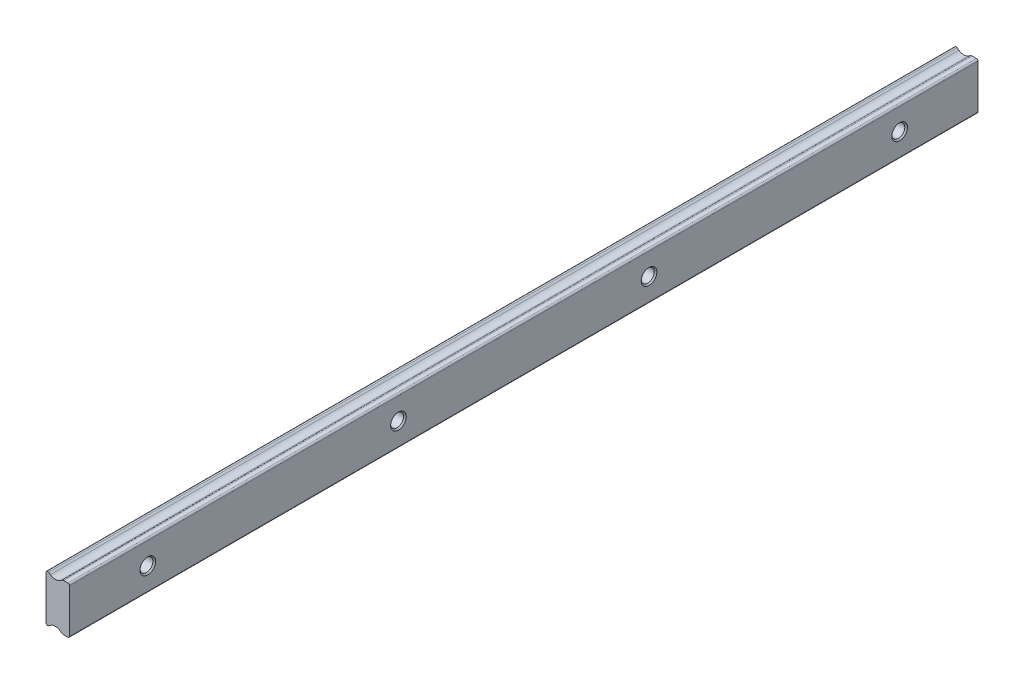
ISO-10303-21;
HEADER;
FILE_DESCRIPTION(('STEP AP214'),'2;1');
FILE_NAME('part.step','',(''),(''),'','','');
FILE_SCHEMA(('AUTOMOTIVE_DESIGN { 1 0 10303 214 1 1 1 1 }'));
ENDSEC;
DATA;
#1=APPLICATION_CONTEXT('core data for automotive mechanical design processes');
#2=APPLICATION_PROTOCOL_DEFINITION('international standard','automotive_design',2000,#1);
#3=PRODUCT_CONTEXT('',#1,'mechanical');
#4=PRODUCT('Part','Part','',(#3));
#5=PRODUCT_RELATED_PRODUCT_CATEGORY('part','',(#4));
#6=PRODUCT_DEFINITION_FORMATION('','',#4);
#7=PRODUCT_DEFINITION_CONTEXT('part definition',#1,'design');
#8=PRODUCT_DEFINITION('design','',#6,#7);
#9=PRODUCT_DEFINITION_SHAPE('','',#8);
#10=(LENGTH_UNIT() NAMED_UNIT(*) SI_UNIT(.MILLI.,.METRE.));
#11=(NAMED_UNIT(*) PLANE_ANGLE_UNIT() SI_UNIT($,.RADIAN.));
#12=(NAMED_UNIT(*) SI_UNIT($,.STERADIAN.) SOLID_ANGLE_UNIT());
#13=UNCERTAINTY_MEASURE_WITH_UNIT(LENGTH_MEASURE(1.E-05),#10,'distance_accuracy_value','');
#14=(GEOMETRIC_REPRESENTATION_CONTEXT(3) GLOBAL_UNCERTAINTY_ASSIGNED_CONTEXT((#13)) GLOBAL_UNIT_ASSIGNED_CONTEXT((#10,
#11,#12)) REPRESENTATION_CONTEXT('',''));
#15=CARTESIAN_POINT('',(0.,0.,0.));
#16=DIRECTION('',(0.,0.,1.));
#17=DIRECTION('',(1.,0.,0.));
#18=AXIS2_PLACEMENT_3D('',#15,#16,#17);
#19=CARTESIAN_POINT('',(8.5,23.2723118075792,148.));
#20=DIRECTION('',(0.,0.,-1.));
#21=DIRECTION('',(-1.,0.,0.));
#22=AXIS2_PLACEMENT_3D('',#19,#20,#21);
#23=CYLINDRICAL_SURFACE('',#22,2.7779999999999);
#24=CARTESIAN_POINT('',(8.5,23.2723118075792,-142.));
#25=DIRECTION('',(0.,0.,1.));
#26=DIRECTION('',(1.,0.,0.));
#27=AXIS2_PLACEMENT_3D('',#24,#25,#26);
#28=CIRCLE('',#27,2.7779999999999);
#29=CARTESIAN_POINT('',(6.9066046598168,20.9967074285445,-142.));
#30=VERTEX_POINT('',#29);
#31=CARTESIAN_POINT('',(10.0933953401832,20.9967074285445,-142.));
#32=VERTEX_POINT('',#31);
#33=EDGE_CURVE('E386',#30,#32,#28,.T.);
#34=ORIENTED_EDGE('',*,*,#33,.F.);
#35=DIRECTION('',(0.,0.,-1.));
#36=VECTOR('',#35,1.);
#37=CARTESIAN_POINT('',(6.9066046598168,20.9967074285445,148.));
#38=LINE('',#37,#36);
#39=CARTESIAN_POINT('',(6.9066046598168,20.9967074285445,148.));
#40=VERTEX_POINT('',#39);
#41=EDGE_CURVE('E402',#40,#30,#38,.T.);
#42=ORIENTED_EDGE('',*,*,#41,.F.);
#43=CARTESIAN_POINT('',(8.5,23.2723118075792,148.));
#44=DIRECTION('',(0.,0.,1.));
#45=DIRECTION('',(1.,0.,0.));
#46=AXIS2_PLACEMENT_3D('',#43,#44,#45);
#47=CIRCLE('',#46,2.7779999999999);
#48=CARTESIAN_POINT('',(10.0933953401832,20.9967074285445,148.));
#49=VERTEX_POINT('',#48);
#50=EDGE_CURVE('E339',#40,#49,#47,.T.);
#51=ORIENTED_EDGE('',*,*,#50,.T.);
#52=DIRECTION('',(0.,0.,-1.));
#53=VECTOR('',#52,1.);
#54=CARTESIAN_POINT('',(10.0933953401832,20.9967074285445,148.));
#55=LINE('',#54,#53);
#56=EDGE_CURVE('E400',#49,#32,#55,.T.);
#57=ORIENTED_EDGE('',*,*,#56,.T.);
#58=EDGE_LOOP('',(#34,#42,#51,#57));
#59=FACE_BOUND('',#58,.T.);
#60=ADVANCED_FACE('F34',(#59),#23,.F.);
#61=CARTESIAN_POINT('',(3.75,10.45,-130.75));
#62=DIRECTION('',(-1.,0.,0.));
#63=DIRECTION('',(0.,0.,1.));
#64=AXIS2_PLACEMENT_3D('',#61,#62,#63);
#65=PLANE('',#64);
#66=DIRECTION('',(0.,1.,0.));
#67=VECTOR('',#66,1.);
#68=CARTESIAN_POINT('',(3.75,10.45,-134.75));
#69=LINE('',#68,#67);
#70=CARTESIAN_POINT('',(3.75,10.45,-134.75));
#71=VERTEX_POINT('',#70);
#72=CARTESIAN_POINT('',(3.75,14.45,-134.75));
#73=VERTEX_POINT('',#72);
#74=EDGE_CURVE('E242',#71,#73,#69,.T.);
#75=ORIENTED_EDGE('',*,*,#74,.F.);
#76=DIRECTION('',(0.,0.,-1.));
#77=VECTOR('',#76,1.);
#78=CARTESIAN_POINT('',(3.75,10.45,-130.75));
#79=LINE('',#78,#77);
#80=CARTESIAN_POINT('',(3.75,10.45,-130.75));
#81=VERTEX_POINT('',#80);
#82=EDGE_CURVE('E251',#81,#71,#79,.T.);
#83=ORIENTED_EDGE('',*,*,#82,.F.);
#84=DIRECTION('',(0.,1.,0.));
#85=VECTOR('',#84,1.);
#86=CARTESIAN_POINT('',(3.75,10.45,-130.75));
#87=LINE('',#86,#85);
#88=CARTESIAN_POINT('',(3.75,14.45,-130.75));
#89=VERTEX_POINT('',#88);
#90=EDGE_CURVE('E233',#81,#89,#87,.T.);
#91=ORIENTED_EDGE('',*,*,#90,.T.);
#92=DIRECTION('',(0.,0.,-1.));
#93=VECTOR('',#92,1.);
#94=CARTESIAN_POINT('',(3.75,14.45,-130.75));
#95=LINE('',#94,#93);
#96=EDGE_CURVE('E249',#89,#73,#95,.T.);
#97=ORIENTED_EDGE('',*,*,#96,.T.);
#98=EDGE_LOOP('',(#75,#83,#91,#97));
#99=FACE_BOUND('',#98,.T.);
#100=ADVANCED_FACE('F496',(#99),#65,.T.);
#101=CARTESIAN_POINT('',(3.75,13.55,136.75));
#102=DIRECTION('',(1.,0.,0.));
#103=DIRECTION('',(0.,0.,-1.));
#104=AXIS2_PLACEMENT_3D('',#101,#102,#103);
#105=PLANE('',#104);
#106=DIRECTION('',(0.,1.,0.));
#107=VECTOR('',#106,1.);
#108=CARTESIAN_POINT('',(3.75,13.55,140.75));
#109=LINE('',#108,#107);
#110=CARTESIAN_POINT('',(3.75,13.55,140.75));
#111=VERTEX_POINT('',#110);
#112=CARTESIAN_POINT('',(3.75,17.55,140.75));
#113=VERTEX_POINT('',#112);
#114=EDGE_CURVE('E856',#111,#113,#109,.T.);
#115=ORIENTED_EDGE('',*,*,#114,.T.);
#116=DIRECTION('',(0.,0.,1.));
#117=VECTOR('',#116,1.);
#118=CARTESIAN_POINT('',(3.75,17.55,136.75));
#119=LINE('',#118,#117);
#120=CARTESIAN_POINT('',(3.75,17.55,136.75));
#121=VERTEX_POINT('',#120);
#122=EDGE_CURVE('E223',#121,#113,#119,.T.);
#123=ORIENTED_EDGE('',*,*,#122,.F.);
#124=DIRECTION('',(0.,1.,0.));
#125=VECTOR('',#124,1.);
#126=CARTESIAN_POINT('',(3.75,13.55,136.75));
#127=LINE('',#126,#125);
#128=CARTESIAN_POINT('',(3.75,13.55,136.75));
#129=VERTEX_POINT('',#128);
#130=EDGE_CURVE('E201',#129,#121,#127,.T.);
#131=ORIENTED_EDGE('',*,*,#130,.F.);
#132=DIRECTION('',(0.,0.,1.));
#133=VECTOR('',#132,1.);
#134=CARTESIAN_POINT('',(3.75,13.55,136.75));
#135=LINE('',#134,#133);
#136=EDGE_CURVE('E198',#129,#111,#135,.T.);
#137=ORIENTED_EDGE('',*,*,#136,.T.);
#138=EDGE_LOOP('',(#115,#123,#131,#137));
#139=FACE_BOUND('',#138,.T.);
#140=ADVANCED_FACE('F498',(#139),#105,.F.);
#141=CARTESIAN_POINT('',(5.5,14.,123.));
#142=DIRECTION('',(1.,0.,0.));
#143=DIRECTION('',(0.,-1.,0.));
#144=AXIS2_PLACEMENT_3D('',#141,#142,#143);
#145=CYLINDRICAL_SURFACE('',#144,2.067);
#146=CARTESIAN_POINT('',(5.933,14.,123.));
#147=DIRECTION('',(1.,0.,0.));
#148=DIRECTION('',(0.,-1.,0.));
#149=AXIS2_PLACEMENT_3D('',#146,#147,#148);
#150=CIRCLE('',#149,2.067);
#151=CARTESIAN_POINT('',(5.933,11.933,123.));
#152=VERTEX_POINT('',#151);
#153=EDGE_CURVE('E292',#152,#152,#150,.T.);
#154=ORIENTED_EDGE('',*,*,#153,.F.);
#155=EDGE_LOOP('',(#154));
#156=FACE_BOUND('',#155,.T.);
#157=CARTESIAN_POINT('',(12.567,14.,123.));
#158=DIRECTION('',(1.,0.,0.));
#159=DIRECTION('',(0.,-1.,0.));
#160=AXIS2_PLACEMENT_3D('',#157,#158,#159);
#161=CIRCLE('',#160,2.067);
#162=CARTESIAN_POINT('',(12.567,11.933,123.));
#163=VERTEX_POINT('',#162);
#164=EDGE_CURVE('E295',#163,#163,#161,.T.);
#165=ORIENTED_EDGE('',*,*,#164,.T.);
#166=EDGE_LOOP('',(#165));
#167=FACE_BOUND('',#166,.T.);
#168=ADVANCED_FACE('F505',(#156,#167),#145,.F.);
#169=CARTESIAN_POINT('',(5.5,14.,43.));
#170=DIRECTION('',(1.,0.,0.));
#171=DIRECTION('',(0.,-1.,0.));
#172=AXIS2_PLACEMENT_3D('',#169,#170,#171);
#173=CYLINDRICAL_SURFACE('',#172,2.067);
#174=CARTESIAN_POINT('',(5.933,14.,43.));
#175=DIRECTION('',(1.,0.,0.));
#176=DIRECTION('',(0.,-1.,0.));
#177=AXIS2_PLACEMENT_3D('',#174,#175,#176);
#178=CIRCLE('',#177,2.067);
#179=CARTESIAN_POINT('',(5.933,11.933,43.));
#180=VERTEX_POINT('',#179);
#181=EDGE_CURVE('E280',#180,#180,#178,.T.);
#182=ORIENTED_EDGE('',*,*,#181,.F.);
#183=EDGE_LOOP('',(#182));
#184=FACE_BOUND('',#183,.T.);
#185=CARTESIAN_POINT('',(12.567,14.,43.));
#186=DIRECTION('',(1.,0.,0.));
#187=DIRECTION('',(0.,-1.,0.));
#188=AXIS2_PLACEMENT_3D('',#185,#186,#187);
#189=CIRCLE('',#188,2.067);
#190=CARTESIAN_POINT('',(12.567,11.933,43.));
#191=VERTEX_POINT('',#190);
#192=EDGE_CURVE('E283',#191,#191,#189,.T.);
#193=ORIENTED_EDGE('',*,*,#192,.T.);
#194=EDGE_LOOP('',(#193));
#195=FACE_BOUND('',#194,.T.);
#196=ADVANCED_FACE('F540',(#184,#195),#173,.F.);
#197=CARTESIAN_POINT('',(5.5,14.,-37.));
#198=DIRECTION('',(1.,0.,0.));
#199=DIRECTION('',(0.,-1.,0.));
#200=AXIS2_PLACEMENT_3D('',#197,#198,#199);
#201=CYLINDRICAL_SURFACE('',#200,2.067);
#202=CARTESIAN_POINT('',(5.933,14.,-37.));
#203=DIRECTION('',(1.,0.,0.));
#204=DIRECTION('',(0.,-1.,0.));
#205=AXIS2_PLACEMENT_3D('',#202,#203,#204);
#206=CIRCLE('',#205,2.067);
#207=CARTESIAN_POINT('',(5.933,11.933,-37.));
#208=VERTEX_POINT('',#207);
#209=EDGE_CURVE('E268',#208,#208,#206,.T.);
#210=ORIENTED_EDGE('',*,*,#209,.F.);
#211=EDGE_LOOP('',(#210));
#212=FACE_BOUND('',#211,.T.);
#213=CARTESIAN_POINT('',(12.567,14.,-37.));
#214=DIRECTION('',(1.,0.,0.));
#215=DIRECTION('',(0.,-1.,0.));
#216=AXIS2_PLACEMENT_3D('',#213,#214,#215);
#217=CIRCLE('',#216,2.067);
#218=CARTESIAN_POINT('',(12.567,11.933,-37.));
#219=VERTEX_POINT('',#218);
#220=EDGE_CURVE('E271',#219,#219,#217,.T.);
#221=ORIENTED_EDGE('',*,*,#220,.T.);
#222=EDGE_LOOP('',(#221));
#223=FACE_BOUND('',#222,.T.);
#224=ADVANCED_FACE('F528',(#212,#223),#201,.F.);
#225=CARTESIAN_POINT('',(5.5,14.,-117.));
#226=DIRECTION('',(1.,0.,0.));
#227=DIRECTION('',(0.,-1.,0.));
#228=AXIS2_PLACEMENT_3D('',#225,#226,#227);
#229=CYLINDRICAL_SURFACE('',#228,2.067);
#230=CARTESIAN_POINT('',(5.933,14.,-117.));
#231=DIRECTION('',(1.,0.,0.));
#232=DIRECTION('',(0.,-1.,0.));
#233=AXIS2_PLACEMENT_3D('',#230,#231,#232);
#234=CIRCLE('',#233,2.067);
#235=CARTESIAN_POINT('',(5.933,11.933,-117.));
#236=VERTEX_POINT('',#235);
#237=EDGE_CURVE('E256',#236,#236,#234,.T.);
#238=ORIENTED_EDGE('',*,*,#237,.F.);
#239=EDGE_LOOP('',(#238));
#240=FACE_BOUND('',#239,.T.);
#241=CARTESIAN_POINT('',(12.567,14.,-117.));
#242=DIRECTION('',(1.,0.,0.));
#243=DIRECTION('',(0.,-1.,0.));
#244=AXIS2_PLACEMENT_3D('',#241,#242,#243);
#245=CIRCLE('',#244,2.067);
#246=CARTESIAN_POINT('',(12.567,11.933,-117.));
#247=VERTEX_POINT('',#246);
#248=EDGE_CURVE('E259',#247,#247,#245,.T.);
#249=ORIENTED_EDGE('',*,*,#248,.T.);
#250=EDGE_LOOP('',(#249));
#251=FACE_BOUND('',#250,.T.);
#252=ADVANCED_FACE('F525',(#240,#251),#229,.F.);
#253=CARTESIAN_POINT('',(5.5,10.45,-134.75));
#254=DIRECTION('',(0.,0.,-1.));
#255=DIRECTION('',(-1.,0.,0.));
#256=AXIS2_PLACEMENT_3D('',#253,#254,#255);
#257=PLANE('',#256);
#258=DIRECTION('',(0.,-1.,0.));
#259=VECTOR('',#258,1.);
#260=CARTESIAN_POINT('',(5.5,14.45,-134.75));
#261=LINE('',#260,#259);
#262=CARTESIAN_POINT('',(5.5,14.45,-134.75));
#263=VERTEX_POINT('',#262);
#264=CARTESIAN_POINT('',(5.5,10.45,-134.75));
#265=VERTEX_POINT('',#264);
#266=EDGE_CURVE('E218',#263,#265,#261,.T.);
#267=ORIENTED_EDGE('',*,*,#266,.T.);
#268=DIRECTION('',(-1.,0.,0.));
#269=VECTOR('',#268,1.);
#270=CARTESIAN_POINT('',(5.5,10.45,-134.75));
#271=LINE('',#270,#269);
#272=EDGE_CURVE('E221',#265,#71,#271,.T.);
#273=ORIENTED_EDGE('',*,*,#272,.T.);
#274=ORIENTED_EDGE('',*,*,#74,.T.);
#275=DIRECTION('',(1.,0.,0.));
#276=VECTOR('',#275,1.);
#277=CARTESIAN_POINT('',(3.75,14.45,-134.75));
#278=LINE('',#277,#276);
#279=EDGE_CURVE('E230',#73,#263,#278,.T.);
#280=ORIENTED_EDGE('',*,*,#279,.T.);
#281=EDGE_LOOP('',(#267,#273,#274,#280));
#282=FACE_BOUND('',#281,.T.);
#283=ADVANCED_FACE('F518',(#282),#257,.T.);
#284=CARTESIAN_POINT('',(5.5,10.45,-130.75));
#285=DIRECTION('',(0.,-1.,0.));
#286=DIRECTION('',(0.,0.,1.));
#287=AXIS2_PLACEMENT_3D('',#284,#285,#286);
#288=PLANE('',#287);
#289=ORIENTED_EDGE('',*,*,#272,.F.);
#290=DIRECTION('',(0.,0.,-1.));
#291=VECTOR('',#290,1.);
#292=CARTESIAN_POINT('',(5.5,10.45,-130.75));
#293=LINE('',#292,#291);
#294=CARTESIAN_POINT('',(5.5,10.45,-130.75));
#295=VERTEX_POINT('',#294);
#296=EDGE_CURVE('E238',#295,#265,#293,.T.);
#297=ORIENTED_EDGE('',*,*,#296,.F.);
#298=DIRECTION('',(-1.,0.,0.));
#299=VECTOR('',#298,1.);
#300=CARTESIAN_POINT('',(5.5,10.45,-130.75));
#301=LINE('',#300,#299);
#302=EDGE_CURVE('E229',#295,#81,#301,.T.);
#303=ORIENTED_EDGE('',*,*,#302,.T.);
#304=ORIENTED_EDGE('',*,*,#82,.T.);
#305=EDGE_LOOP('',(#289,#297,#303,#304));
#306=FACE_BOUND('',#305,.T.);
#307=ADVANCED_FACE('F514',(#306),#288,.T.);
#308=CARTESIAN_POINT('',(5.5,10.45,-130.75));
#309=DIRECTION('',(0.,0.,-1.));
#310=DIRECTION('',(-1.,0.,0.));
#311=AXIS2_PLACEMENT_3D('',#308,#309,#310);
#312=PLANE('',#311);
#313=DIRECTION('',(0.,-1.,0.));
#314=VECTOR('',#313,1.);
#315=CARTESIAN_POINT('',(5.5,14.45,-130.75));
#316=LINE('',#315,#314);
#317=CARTESIAN_POINT('',(5.5,14.45,-130.75));
#318=VERTEX_POINT('',#317);
#319=EDGE_CURVE('E227',#318,#295,#316,.T.);
#320=ORIENTED_EDGE('',*,*,#319,.F.);
#321=DIRECTION('',(1.,0.,0.));
#322=VECTOR('',#321,1.);
#323=CARTESIAN_POINT('',(3.75,14.45,-130.75));
#324=LINE('',#323,#322);
#325=EDGE_CURVE('E236',#89,#318,#324,.T.);
#326=ORIENTED_EDGE('',*,*,#325,.F.);
#327=ORIENTED_EDGE('',*,*,#90,.F.);
#328=ORIENTED_EDGE('',*,*,#302,.F.);
#329=EDGE_LOOP('',(#320,#326,#327,#328));
#330=FACE_BOUND('',#329,.T.);
#331=ADVANCED_FACE('F517',(#330),#312,.F.);
#332=CARTESIAN_POINT('',(3.75,14.45,-130.75));
#333=DIRECTION('',(0.,1.,0.));
#334=DIRECTION('',(0.,0.,-1.));
#335=AXIS2_PLACEMENT_3D('',#332,#333,#334);
#336=PLANE('',#335);
#337=ORIENTED_EDGE('',*,*,#279,.F.);
#338=ORIENTED_EDGE('',*,*,#96,.F.);
#339=ORIENTED_EDGE('',*,*,#325,.T.);
#340=DIRECTION('',(0.,0.,-1.));
#341=VECTOR('',#340,1.);
#342=CARTESIAN_POINT('',(5.5,14.45,-130.75));
#343=LINE('',#342,#341);
#344=EDGE_CURVE('E59',#318,#263,#343,.T.);
#345=ORIENTED_EDGE('',*,*,#344,.T.);
#346=EDGE_LOOP('',(#337,#338,#339,#345));
#347=FACE_BOUND('',#346,.T.);
#348=ADVANCED_FACE('F512',(#347),#336,.T.);
#349=CARTESIAN_POINT('',(5.933,14.,-117.));
#350=DIRECTION('',(-1.,0.,0.));
#351=DIRECTION('',(0.,1.,0.));
#352=AXIS2_PLACEMENT_3D('',#349,#350,#351);
#353=CONICAL_SURFACE('',#352,2.067,0.78539816339745);
#354=CARTESIAN_POINT('',(5.5,14.,-117.));
#355=DIRECTION('',(1.,0.,0.));
#356=DIRECTION('',(0.,-1.,0.));
#357=AXIS2_PLACEMENT_3D('',#354,#355,#356);
#358=CIRCLE('',#357,2.5);
#359=CARTESIAN_POINT('',(5.5,11.5,-117.));
#360=VERTEX_POINT('',#359);
#361=EDGE_CURVE('E248',#360,#360,#358,.T.);
#362=ORIENTED_EDGE('',*,*,#361,.F.);
#363=EDGE_LOOP('',(#362));
#364=FACE_BOUND('',#363,.T.);
#365=ORIENTED_EDGE('',*,*,#237,.T.);
#366=EDGE_LOOP('',(#365));
#367=FACE_BOUND('',#366,.T.);
#368=ADVANCED_FACE('F520',(#364,#367),#353,.F.);
#369=CARTESIAN_POINT('',(5.933,14.,-37.));
#370=DIRECTION('',(-1.,0.,0.));
#371=DIRECTION('',(0.,1.,0.));
#372=AXIS2_PLACEMENT_3D('',#369,#370,#371);
#373=CONICAL_SURFACE('',#372,2.067,0.78539816339745);
#374=CARTESIAN_POINT('',(5.5,14.,-37.));
#375=DIRECTION('',(1.,0.,0.));
#376=DIRECTION('',(0.,-1.,0.));
#377=AXIS2_PLACEMENT_3D('',#374,#375,#376);
#378=CIRCLE('',#377,2.5);
#379=CARTESIAN_POINT('',(5.5,11.5,-37.));
#380=VERTEX_POINT('',#379);
#381=EDGE_CURVE('E265',#380,#380,#378,.T.);
#382=ORIENTED_EDGE('',*,*,#381,.F.);
#383=EDGE_LOOP('',(#382));
#384=FACE_BOUND('',#383,.T.);
#385=ORIENTED_EDGE('',*,*,#209,.T.);
#386=EDGE_LOOP('',(#385));
#387=FACE_BOUND('',#386,.T.);
#388=ADVANCED_FACE('F523',(#384,#387),#373,.F.);
#389=CARTESIAN_POINT('',(5.933,14.,43.));
#390=DIRECTION('',(-1.,0.,0.));
#391=DIRECTION('',(0.,1.,0.));
#392=AXIS2_PLACEMENT_3D('',#389,#390,#391);
#393=CONICAL_SURFACE('',#392,2.067,0.78539816339745);
#394=CARTESIAN_POINT('',(5.5,14.,43.));
#395=DIRECTION('',(1.,0.,0.));
#396=DIRECTION('',(0.,-1.,0.));
#397=AXIS2_PLACEMENT_3D('',#394,#395,#396);
#398=CIRCLE('',#397,2.5);
#399=CARTESIAN_POINT('',(5.5,11.5,43.));
#400=VERTEX_POINT('',#399);
#401=EDGE_CURVE('E277',#400,#400,#398,.T.);
#402=ORIENTED_EDGE('',*,*,#401,.F.);
#403=EDGE_LOOP('',(#402));
#404=FACE_BOUND('',#403,.T.);
#405=ORIENTED_EDGE('',*,*,#181,.T.);
#406=EDGE_LOOP('',(#405));
#407=FACE_BOUND('',#406,.T.);
#408=ADVANCED_FACE('F536',(#404,#407),#393,.F.);
#409=CARTESIAN_POINT('',(5.933,14.,123.));
#410=DIRECTION('',(-1.,0.,0.));
#411=DIRECTION('',(0.,1.,0.));
#412=AXIS2_PLACEMENT_3D('',#409,#410,#411);
#413=CONICAL_SURFACE('',#412,2.067,0.78539816339745);
#414=CARTESIAN_POINT('',(5.5,14.,123.));
#415=DIRECTION('',(1.,0.,0.));
#416=DIRECTION('',(0.,-1.,0.));
#417=AXIS2_PLACEMENT_3D('',#414,#415,#416);
#418=CIRCLE('',#417,2.5);
#419=CARTESIAN_POINT('',(5.5,11.5,123.));
#420=VERTEX_POINT('',#419);
#421=EDGE_CURVE('E289',#420,#420,#418,.T.);
#422=ORIENTED_EDGE('',*,*,#421,.F.);
#423=EDGE_LOOP('',(#422));
#424=FACE_BOUND('',#423,.T.);
#425=ORIENTED_EDGE('',*,*,#153,.T.);
#426=EDGE_LOOP('',(#425));
#427=FACE_BOUND('',#426,.T.);
#428=ADVANCED_FACE('F548',(#424,#427),#413,.F.);
#429=CARTESIAN_POINT('',(5.5,13.55,136.75));
#430=DIRECTION('',(0.,1.,0.));
#431=DIRECTION('',(0.,0.,-1.));
#432=AXIS2_PLACEMENT_3D('',#429,#430,#431);
#433=PLANE('',#432);
#434=DIRECTION('',(-1.,0.,0.));
#435=VECTOR('',#434,1.);
#436=CARTESIAN_POINT('',(5.5,13.55,140.75));
#437=LINE('',#436,#435);
#438=CARTESIAN_POINT('',(5.5,13.55,140.75));
#439=VERTEX_POINT('',#438);
#440=EDGE_CURVE('E858',#439,#111,#437,.T.);
#441=ORIENTED_EDGE('',*,*,#440,.T.);
#442=ORIENTED_EDGE('',*,*,#136,.F.);
#443=DIRECTION('',(-1.,0.,0.));
#444=VECTOR('',#443,1.);
#445=CARTESIAN_POINT('',(5.5,13.55,136.75));
#446=LINE('',#445,#444);
#447=CARTESIAN_POINT('',(5.5,13.55,136.75));
#448=VERTEX_POINT('',#447);
#449=EDGE_CURVE('E194',#448,#129,#446,.T.);
#450=ORIENTED_EDGE('',*,*,#449,.F.);
#451=DIRECTION('',(0.,0.,1.));
#452=VECTOR('',#451,1.);
#453=CARTESIAN_POINT('',(5.5,13.55,136.75));
#454=LINE('',#453,#452);
#455=EDGE_CURVE('E51',#448,#439,#454,.T.);
#456=ORIENTED_EDGE('',*,*,#455,.T.);
#457=EDGE_LOOP('',(#441,#442,#450,#456));
#458=FACE_BOUND('',#457,.T.);
#459=ADVANCED_FACE('F196',(#458),#433,.F.);
#460=CARTESIAN_POINT('',(5.5,13.55,140.75));
#461=DIRECTION('',(0.,0.,-1.));
#462=DIRECTION('',(-1.,0.,0.));
#463=AXIS2_PLACEMENT_3D('',#460,#461,#462);
#464=PLANE('',#463);
#465=DIRECTION('',(0.,-1.,0.));
#466=VECTOR('',#465,1.);
#467=CARTESIAN_POINT('',(5.5,17.55,140.75));
#468=LINE('',#467,#466);
#469=CARTESIAN_POINT('',(5.5,17.55,140.75));
#470=VERTEX_POINT('',#469);
#471=EDGE_CURVE('E217',#470,#439,#468,.T.);
#472=ORIENTED_EDGE('',*,*,#471,.F.);
#473=DIRECTION('',(1.,0.,0.));
#474=VECTOR('',#473,1.);
#475=CARTESIAN_POINT('',(3.75,17.55,140.75));
#476=LINE('',#475,#474);
#477=EDGE_CURVE('E211',#113,#470,#476,.T.);
#478=ORIENTED_EDGE('',*,*,#477,.F.);
#479=ORIENTED_EDGE('',*,*,#114,.F.);
#480=ORIENTED_EDGE('',*,*,#440,.F.);
#481=EDGE_LOOP('',(#472,#478,#479,#480));
#482=FACE_BOUND('',#481,.T.);
#483=ADVANCED_FACE('F778',(#482),#464,.F.);
#484=CARTESIAN_POINT('',(3.75,17.55,136.75));
#485=DIRECTION('',(0.,-1.,0.));
#486=DIRECTION('',(0.,0.,1.));
#487=AXIS2_PLACEMENT_3D('',#484,#485,#486);
#488=PLANE('',#487);
#489=ORIENTED_EDGE('',*,*,#477,.T.);
#490=DIRECTION('',(0.,0.,1.));
#491=VECTOR('',#490,1.);
#492=CARTESIAN_POINT('',(5.5,17.55,136.75));
#493=LINE('',#492,#491);
#494=CARTESIAN_POINT('',(5.5,17.55,136.75));
#495=VERTEX_POINT('',#494);
#496=EDGE_CURVE('E853',#495,#470,#493,.T.);
#497=ORIENTED_EDGE('',*,*,#496,.F.);
#498=DIRECTION('',(1.,0.,0.));
#499=VECTOR('',#498,1.);
#500=CARTESIAN_POINT('',(3.75,17.55,136.75));
#501=LINE('',#500,#499);
#502=EDGE_CURVE('E207',#121,#495,#501,.T.);
#503=ORIENTED_EDGE('',*,*,#502,.F.);
#504=ORIENTED_EDGE('',*,*,#122,.T.);
#505=EDGE_LOOP('',(#489,#497,#503,#504));
#506=FACE_BOUND('',#505,.T.);
#507=ADVANCED_FACE('F773',(#506),#488,.F.);
#508=CARTESIAN_POINT('',(5.5,13.55,136.75));
#509=DIRECTION('',(0.,0.,-1.));
#510=DIRECTION('',(-1.,0.,0.));
#511=AXIS2_PLACEMENT_3D('',#508,#509,#510);
#512=PLANE('',#511);
#513=DIRECTION('',(0.,-1.,0.));
#514=VECTOR('',#513,1.);
#515=CARTESIAN_POINT('',(5.5,17.55,136.75));
#516=LINE('',#515,#514);
#517=EDGE_CURVE('E202',#495,#448,#516,.T.);
#518=ORIENTED_EDGE('',*,*,#517,.T.);
#519=ORIENTED_EDGE('',*,*,#449,.T.);
#520=ORIENTED_EDGE('',*,*,#130,.T.);
#521=ORIENTED_EDGE('',*,*,#502,.T.);
#522=EDGE_LOOP('',(#518,#519,#520,#521));
#523=FACE_BOUND('',#522,.T.);
#524=ADVANCED_FACE('F205',(#523),#512,.T.);
#525=CARTESIAN_POINT('',(13.,14.,123.));
#526=DIRECTION('',(1.,0.,0.));
#527=DIRECTION('',(0.,-1.,0.));
#528=AXIS2_PLACEMENT_3D('',#525,#526,#527);
#529=CONICAL_SURFACE('',#528,2.5,0.785398163397447);
#530=ORIENTED_EDGE('',*,*,#164,.F.);
#531=EDGE_LOOP('',(#530));
#532=FACE_BOUND('',#531,.T.);
#533=CARTESIAN_POINT('',(13.,14.,123.));
#534=DIRECTION('',(1.,0.,0.));
#535=DIRECTION('',(0.,-1.,0.));
#536=AXIS2_PLACEMENT_3D('',#533,#534,#535);
#537=CIRCLE('',#536,2.5);
#538=CARTESIAN_POINT('',(13.,11.5,123.));
#539=VERTEX_POINT('',#538);
#540=EDGE_CURVE('E298',#539,#539,#537,.T.);
#541=ORIENTED_EDGE('',*,*,#540,.T.);
#542=EDGE_LOOP('',(#541));
#543=FACE_BOUND('',#542,.T.);
#544=ADVANCED_FACE('F555',(#532,#543),#529,.F.);
#545=CARTESIAN_POINT('',(13.,14.,43.));
#546=DIRECTION('',(1.,0.,0.));
#547=DIRECTION('',(0.,-1.,0.));
#548=AXIS2_PLACEMENT_3D('',#545,#546,#547);
#549=CONICAL_SURFACE('',#548,2.5,0.785398163397447);
#550=ORIENTED_EDGE('',*,*,#192,.F.);
#551=EDGE_LOOP('',(#550));
#552=FACE_BOUND('',#551,.T.);
#553=CARTESIAN_POINT('',(13.,14.,43.));
#554=DIRECTION('',(1.,0.,0.));
#555=DIRECTION('',(0.,-1.,0.));
#556=AXIS2_PLACEMENT_3D('',#553,#554,#555);
#557=CIRCLE('',#556,2.5);
#558=CARTESIAN_POINT('',(13.,11.5,43.));
#559=VERTEX_POINT('',#558);
#560=EDGE_CURVE('E286',#559,#559,#557,.T.);
#561=ORIENTED_EDGE('',*,*,#560,.T.);
#562=EDGE_LOOP('',(#561));
#563=FACE_BOUND('',#562,.T.);
#564=ADVANCED_FACE('F544',(#552,#563),#549,.F.);
#565=CARTESIAN_POINT('',(13.,14.,-37.));
#566=DIRECTION('',(1.,0.,0.));
#567=DIRECTION('',(0.,-1.,0.));
#568=AXIS2_PLACEMENT_3D('',#565,#566,#567);
#569=CONICAL_SURFACE('',#568,2.5,0.785398163397447);
#570=ORIENTED_EDGE('',*,*,#220,.F.);
#571=EDGE_LOOP('',(#570));
#572=FACE_BOUND('',#571,.T.);
#573=CARTESIAN_POINT('',(13.,14.,-37.));
#574=DIRECTION('',(1.,0.,0.));
#575=DIRECTION('',(0.,-1.,0.));
#576=AXIS2_PLACEMENT_3D('',#573,#574,#575);
#577=CIRCLE('',#576,2.5);
#578=CARTESIAN_POINT('',(13.,11.5,-37.));
#579=VERTEX_POINT('',#578);
#580=EDGE_CURVE('E274',#579,#579,#577,.T.);
#581=ORIENTED_EDGE('',*,*,#580,.T.);
#582=EDGE_LOOP('',(#581));
#583=FACE_BOUND('',#582,.T.);
#584=ADVANCED_FACE('F532',(#572,#583),#569,.F.);
#585=CARTESIAN_POINT('',(13.,14.,-117.));
#586=DIRECTION('',(1.,0.,0.));
#587=DIRECTION('',(0.,-1.,0.));
#588=AXIS2_PLACEMENT_3D('',#585,#586,#587);
#589=CONICAL_SURFACE('',#588,2.5,0.785398163397447);
#590=ORIENTED_EDGE('',*,*,#248,.F.);
#591=EDGE_LOOP('',(#590));
#592=FACE_BOUND('',#591,.T.);
#593=CARTESIAN_POINT('',(13.,14.,-117.));
#594=DIRECTION('',(1.,0.,0.));
#595=DIRECTION('',(0.,-1.,0.));
#596=AXIS2_PLACEMENT_3D('',#593,#594,#595);
#597=CIRCLE('',#596,2.5);
#598=CARTESIAN_POINT('',(13.,11.5,-117.));
#599=VERTEX_POINT('',#598);
#600=EDGE_CURVE('E262',#599,#599,#597,.T.);
#601=ORIENTED_EDGE('',*,*,#600,.T.);
#602=EDGE_LOOP('',(#601));
#603=FACE_BOUND('',#602,.T.);
#604=ADVANCED_FACE('F494',(#592,#603),#589,.F.);
#605=CARTESIAN_POINT('',(11.1274704117947,21.5,148.));
#606=DIRECTION('',(0.,1.,0.));
#607=DIRECTION('',(0.,0.,-1.));
#608=AXIS2_PLACEMENT_3D('',#605,#606,#607);
#609=PLANE('',#608);
#610=DIRECTION('',(1.,0.,0.));
#611=VECTOR('',#610,1.);
#612=CARTESIAN_POINT('',(11.1274704117947,21.5,-142.));
#613=LINE('',#612,#611);
#614=CARTESIAN_POINT('',(11.1274704117947,21.5,-142.));
#615=VERTEX_POINT('',#614);
#616=CARTESIAN_POINT('',(12.5,21.5,-142.));
#617=VERTEX_POINT('',#616);
#618=EDGE_CURVE('E306',#615,#617,#613,.T.);
#619=ORIENTED_EDGE('',*,*,#618,.F.);
#620=DIRECTION('',(0.,0.,-1.));
#621=VECTOR('',#620,1.);
#622=CARTESIAN_POINT('',(11.1274704117947,21.5,148.));
#623=LINE('',#622,#621);
#624=CARTESIAN_POINT('',(11.1274704117947,21.5,148.));
#625=VERTEX_POINT('',#624);
#626=EDGE_CURVE('E43',#625,#615,#623,.T.);
#627=ORIENTED_EDGE('',*,*,#626,.F.);
#628=DIRECTION('',(1.,0.,0.));
#629=VECTOR('',#628,1.);
#630=CARTESIAN_POINT('',(11.1274704117947,21.5,148.));
#631=LINE('',#630,#629);
#632=CARTESIAN_POINT('',(12.5,21.5,148.));
#633=VERTEX_POINT('',#632);
#634=EDGE_CURVE('E348',#625,#633,#631,.T.);
#635=ORIENTED_EDGE('',*,*,#634,.T.);
#636=DIRECTION('',(0.,0.,-1.));
#637=VECTOR('',#636,1.);
#638=CARTESIAN_POINT('',(12.5,21.5,148.));
#639=LINE('',#638,#637);
#640=EDGE_CURVE('E11',#633,#617,#639,.T.);
#641=ORIENTED_EDGE('',*,*,#640,.T.);
#642=EDGE_LOOP('',(#619,#627,#635,#641));
#643=FACE_BOUND('',#642,.T.);
#644=ADVANCED_FACE('F435',(#643),#609,.T.);
#645=CARTESIAN_POINT('',(11.1274704117947,20.4999999999992,148.));
#646=DIRECTION('',(0.,0.,-1.));
#647=DIRECTION('',(-1.,0.,0.));
#648=AXIS2_PLACEMENT_3D('',#645,#646,#647);
#649=CYLINDRICAL_SURFACE('',#648,1.00000000000079);
#650=CARTESIAN_POINT('',(11.1274704117947,20.4999999999992,-142.));
#651=DIRECTION('',(0.,0.,-1.));
#652=DIRECTION('',(-1.,0.,0.));
#653=AXIS2_PLACEMENT_3D('',#650,#651,#652);
#654=CIRCLE('',#653,1.00000000000079);
#655=CARTESIAN_POINT('',(10.5538939754432,21.3191520442888,-142.));
#656=VERTEX_POINT('',#655);
#657=EDGE_CURVE('E392',#656,#615,#654,.T.);
#658=ORIENTED_EDGE('',*,*,#657,.F.);
#659=DIRECTION('',(0.,0.,-1.));
#660=VECTOR('',#659,1.);
#661=CARTESIAN_POINT('',(10.5538939754432,21.3191520442888,148.));
#662=LINE('',#661,#660);
#663=CARTESIAN_POINT('',(10.5538939754432,21.3191520442888,148.));
#664=VERTEX_POINT('',#663);
#665=EDGE_CURVE('E398',#664,#656,#662,.T.);
#666=ORIENTED_EDGE('',*,*,#665,.F.);
#667=CARTESIAN_POINT('',(11.1274704117947,20.4999999999992,148.));
#668=DIRECTION('',(0.,0.,-1.));
#669=DIRECTION('',(-1.,0.,0.));
#670=AXIS2_PLACEMENT_3D('',#667,#668,#669);
#671=CIRCLE('',#670,1.00000000000079);
#672=EDGE_CURVE('E345',#664,#625,#671,.T.);
#673=ORIENTED_EDGE('',*,*,#672,.T.);
#674=ORIENTED_EDGE('',*,*,#626,.T.);
#675=EDGE_LOOP('',(#658,#666,#673,#674));
#676=FACE_BOUND('',#675,.T.);
#677=ADVANCED_FACE('F486',(#676),#649,.T.);
#678=CARTESIAN_POINT('',(10.0933953401832,20.9967074285445,148.));
#679=DIRECTION('',(-0.573576436351076,0.819152044288971,0.));
#680=DIRECTION('',(0.819152044288971,0.573576436351076,0.));
#681=AXIS2_PLACEMENT_3D('',#678,#679,#680);
#682=PLANE('',#681);
#683=DIRECTION('',(0.819152044288971,0.573576436351076,0.));
#684=VECTOR('',#683,1.);
#685=CARTESIAN_POINT('',(10.0933953401832,20.9967074285445,-142.));
#686=LINE('',#685,#684);
#687=EDGE_CURVE('E389',#32,#656,#686,.T.);
#688=ORIENTED_EDGE('',*,*,#687,.F.);
#689=ORIENTED_EDGE('',*,*,#56,.F.);
#690=DIRECTION('',(0.819152044288971,0.573576436351076,0.));
#691=VECTOR('',#690,1.);
#692=CARTESIAN_POINT('',(10.0933953401832,20.9967074285445,148.));
#693=LINE('',#692,#691);
#694=EDGE_CURVE('E342',#49,#664,#693,.T.);
#695=ORIENTED_EDGE('',*,*,#694,.T.);
#696=ORIENTED_EDGE('',*,*,#665,.T.);
#697=EDGE_LOOP('',(#688,#689,#695,#696));
#698=FACE_BOUND('',#697,.T.);
#699=ADVANCED_FACE('F484',(#698),#682,.T.);
#700=CARTESIAN_POINT('',(6.3229804762116,21.4053654813864,148.));
#701=DIRECTION('',(0.573576436351095,0.819152044288958,0.));
#702=DIRECTION('',(0.819152044288958,-0.573576436351095,0.));
#703=AXIS2_PLACEMENT_3D('',#700,#701,#702);
#704=PLANE('',#703);
#705=DIRECTION('',(0.819152044288958,-0.573576436351095,0.));
#706=VECTOR('',#705,1.);
#707=CARTESIAN_POINT('',(6.3229804762116,21.4053654813864,-142.));
#708=LINE('',#707,#706);
#709=CARTESIAN_POINT('',(6.3229804762116,21.4053654813864,-142.));
#710=VERTEX_POINT('',#709);
#711=EDGE_CURVE('E383',#710,#30,#708,.T.);
#712=ORIENTED_EDGE('',*,*,#711,.F.);
#713=DIRECTION('',(0.,0.,-1.));
#714=VECTOR('',#713,1.);
#715=CARTESIAN_POINT('',(6.3229804762116,21.4053654813864,148.));
#716=LINE('',#715,#714);
#717=CARTESIAN_POINT('',(6.3229804762116,21.4053654813864,148.));
#718=VERTEX_POINT('',#717);
#719=EDGE_CURVE('E404',#718,#710,#716,.T.);
#720=ORIENTED_EDGE('',*,*,#719,.F.);
#721=DIRECTION('',(0.819152044288958,-0.573576436351095,0.));
#722=VECTOR('',#721,1.);
#723=CARTESIAN_POINT('',(6.3229804762116,21.4053654813864,148.));
#724=LINE('',#723,#722);
#725=EDGE_CURVE('E336',#718,#40,#724,.T.);
#726=ORIENTED_EDGE('',*,*,#725,.T.);
#727=ORIENTED_EDGE('',*,*,#41,.T.);
#728=EDGE_LOOP('',(#712,#720,#726,#727));
#729=FACE_BOUND('',#728,.T.);
#730=ADVANCED_FACE('F477',(#729),#704,.T.);
#731=CARTESIAN_POINT('',(6.02300000000006,20.9769489622231,148.));
#732=DIRECTION('',(0.,0.,-1.));
#733=DIRECTION('',(-1.,0.,0.));
#734=AXIS2_PLACEMENT_3D('',#731,#732,#733);
#735=CYLINDRICAL_SURFACE('',#734,0.523000000000062);
#736=CARTESIAN_POINT('',(6.02300000000006,20.9769489622231,-142.));
#737=DIRECTION('',(0.,0.,-1.));
#738=DIRECTION('',(-1.,0.,0.));
#739=AXIS2_PLACEMENT_3D('',#736,#737,#738);
#740=CIRCLE('',#739,0.523000000000062);
#741=CARTESIAN_POINT('',(5.5,20.9769489622232,-142.));
#742=VERTEX_POINT('',#741);
#743=EDGE_CURVE('E380',#742,#710,#740,.T.);
#744=ORIENTED_EDGE('',*,*,#743,.F.);
#745=DIRECTION('',(0.,0.,-1.));
#746=VECTOR('',#745,1.);
#747=CARTESIAN_POINT('',(5.5,20.9769489622232,148.));
#748=LINE('',#747,#746);
#749=CARTESIAN_POINT('',(5.5,20.9769489622232,148.));
#750=VERTEX_POINT('',#749);
#751=EDGE_CURVE('E406',#750,#742,#748,.T.);
#752=ORIENTED_EDGE('',*,*,#751,.F.);
#753=CARTESIAN_POINT('',(6.02300000000006,20.9769489622231,148.));
#754=DIRECTION('',(0.,0.,-1.));
#755=DIRECTION('',(-1.,0.,0.));
#756=AXIS2_PLACEMENT_3D('',#753,#754,#755);
#757=CIRCLE('',#756,0.523000000000062);
#758=EDGE_CURVE('E333',#750,#718,#757,.T.);
#759=ORIENTED_EDGE('',*,*,#758,.T.);
#760=ORIENTED_EDGE('',*,*,#719,.T.);
#761=EDGE_LOOP('',(#744,#752,#759,#760));
#762=FACE_BOUND('',#761,.T.);
#763=ADVANCED_FACE('F473',(#762),#735,.T.);
#764=CARTESIAN_POINT('',(5.5,7.0230510377768,148.));
#765=DIRECTION('',(-1.,0.,0.));
#766=DIRECTION('',(0.,0.,1.));
#767=AXIS2_PLACEMENT_3D('',#764,#765,#766);
#768=PLANE('',#767);
#769=ORIENTED_EDGE('',*,*,#517,.F.);
#770=ORIENTED_EDGE('',*,*,#496,.T.);
#771=ORIENTED_EDGE('',*,*,#471,.T.);
#772=ORIENTED_EDGE('',*,*,#455,.F.);
#773=EDGE_LOOP('',(#769,#770,#771,#772));
#774=FACE_BOUND('',#773,.T.);
#775=DIRECTION('',(0.,1.,0.));
#776=VECTOR('',#775,1.);
#777=CARTESIAN_POINT('',(5.5,7.0230510377768,-142.));
#778=LINE('',#777,#776);
#779=CARTESIAN_POINT('',(5.5,7.0230510377768,-142.));
#780=VERTEX_POINT('',#779);
#781=EDGE_CURVE('E377',#780,#742,#778,.T.);
#782=ORIENTED_EDGE('',*,*,#781,.F.);
#783=DIRECTION('',(0.,0.,-1.));
#784=VECTOR('',#783,1.);
#785=CARTESIAN_POINT('',(5.5,7.0230510377768,148.));
#786=LINE('',#785,#784);
#787=CARTESIAN_POINT('',(5.5,7.0230510377768,148.));
#788=VERTEX_POINT('',#787);
#789=EDGE_CURVE('E408',#788,#780,#786,.T.);
#790=ORIENTED_EDGE('',*,*,#789,.F.);
#791=DIRECTION('',(0.,1.,0.));
#792=VECTOR('',#791,1.);
#793=CARTESIAN_POINT('',(5.5,7.0230510377768,148.));
#794=LINE('',#793,#792);
#795=EDGE_CURVE('E330',#788,#750,#794,.T.);
#796=ORIENTED_EDGE('',*,*,#795,.T.);
#797=ORIENTED_EDGE('',*,*,#751,.T.);
#798=EDGE_LOOP('',(#782,#790,#796,#797));
#799=FACE_BOUND('',#798,.T.);
#800=ORIENTED_EDGE('',*,*,#421,.T.);
#801=EDGE_LOOP('',(#800));
#802=FACE_BOUND('',#801,.T.);
#803=ORIENTED_EDGE('',*,*,#401,.T.);
#804=EDGE_LOOP('',(#803));
#805=FACE_BOUND('',#804,.T.);
#806=ORIENTED_EDGE('',*,*,#381,.T.);
#807=EDGE_LOOP('',(#806));
#808=FACE_BOUND('',#807,.T.);
#809=ORIENTED_EDGE('',*,*,#361,.T.);
#810=EDGE_LOOP('',(#809));
#811=FACE_BOUND('',#810,.T.);
#812=ORIENTED_EDGE('',*,*,#344,.F.);
#813=ORIENTED_EDGE('',*,*,#319,.T.);
#814=ORIENTED_EDGE('',*,*,#296,.T.);
#815=ORIENTED_EDGE('',*,*,#266,.F.);
#816=EDGE_LOOP('',(#812,#813,#814,#815));
#817=FACE_BOUND('',#816,.T.);
#818=ADVANCED_FACE('F214',(#774,#799,#802,#805,#808,#811,#817),#768,.T.);
#819=CARTESIAN_POINT('',(6.02300000000006,7.02305103777686,148.));
#820=DIRECTION('',(0.,0.,-1.));
#821=DIRECTION('',(-1.,0.,0.));
#822=AXIS2_PLACEMENT_3D('',#819,#820,#821);
#823=CYLINDRICAL_SURFACE('',#822,0.523000000000062);
#824=CARTESIAN_POINT('',(6.02300000000006,7.02305103777686,-142.));
#825=DIRECTION('',(0.,0.,-1.));
#826=DIRECTION('',(-1.,0.,0.));
#827=AXIS2_PLACEMENT_3D('',#824,#825,#826);
#828=CIRCLE('',#827,0.523000000000062);
#829=CARTESIAN_POINT('',(6.32298047621172,6.59463451861369,-142.));
#830=VERTEX_POINT('',#829);
#831=EDGE_CURVE('E374',#830,#780,#828,.T.);
#832=ORIENTED_EDGE('',*,*,#831,.F.);
#833=DIRECTION('',(0.,0.,-1.));
#834=VECTOR('',#833,1.);
#835=CARTESIAN_POINT('',(6.32298047621172,6.59463451861369,148.));
#836=LINE('',#835,#834);
#837=CARTESIAN_POINT('',(6.32298047621172,6.59463451861369,148.));
#838=VERTEX_POINT('',#837);
#839=EDGE_CURVE('E410',#838,#830,#836,.T.);
#840=ORIENTED_EDGE('',*,*,#839,.F.);
#841=CARTESIAN_POINT('',(6.02300000000006,7.02305103777686,148.));
#842=DIRECTION('',(0.,0.,-1.));
#843=DIRECTION('',(-1.,0.,0.));
#844=AXIS2_PLACEMENT_3D('',#841,#842,#843);
#845=CIRCLE('',#844,0.523000000000062);
#846=EDGE_CURVE('E327',#838,#788,#845,.T.);
#847=ORIENTED_EDGE('',*,*,#846,.T.);
#848=ORIENTED_EDGE('',*,*,#789,.T.);
#849=EDGE_LOOP('',(#832,#840,#847,#848));
#850=FACE_BOUND('',#849,.T.);
#851=ADVANCED_FACE('F466',(#850),#823,.T.);
#852=CARTESIAN_POINT('',(6.9066046598168,7.0032925714555,148.));
#853=DIRECTION('',(0.573576436351094,-0.819152044288958,0.));
#854=DIRECTION('',(-0.819152044288958,-0.573576436351094,0.));
#855=AXIS2_PLACEMENT_3D('',#852,#853,#854);
#856=PLANE('',#855);
#857=DIRECTION('',(-0.819152044288958,-0.573576436351094,0.));
#858=VECTOR('',#857,1.);
#859=CARTESIAN_POINT('',(6.9066046598168,7.0032925714555,-142.));
#860=LINE('',#859,#858);
#861=CARTESIAN_POINT('',(6.9066046598168,7.0032925714555,-142.));
#862=VERTEX_POINT('',#861);
#863=EDGE_CURVE('E371',#862,#830,#860,.T.);
#864=ORIENTED_EDGE('',*,*,#863,.F.);
#865=DIRECTION('',(0.,0.,-1.));
#866=VECTOR('',#865,1.);
#867=CARTESIAN_POINT('',(6.9066046598168,7.0032925714555,148.));
#868=LINE('',#867,#866);
#869=CARTESIAN_POINT('',(6.9066046598168,7.0032925714555,148.));
#870=VERTEX_POINT('',#869);
#871=EDGE_CURVE('E412',#870,#862,#868,.T.);
#872=ORIENTED_EDGE('',*,*,#871,.F.);
#873=DIRECTION('',(-0.819152044288958,-0.573576436351094,0.));
#874=VECTOR('',#873,1.);
#875=CARTESIAN_POINT('',(6.9066046598168,7.0032925714555,148.));
#876=LINE('',#875,#874);
#877=EDGE_CURVE('E324',#870,#838,#876,.T.);
#878=ORIENTED_EDGE('',*,*,#877,.T.);
#879=ORIENTED_EDGE('',*,*,#839,.T.);
#880=EDGE_LOOP('',(#864,#872,#878,#879));
#881=FACE_BOUND('',#880,.T.);
#882=ADVANCED_FACE('F462',(#881),#856,.T.);
#883=CARTESIAN_POINT('',(10.5538939754432,6.68084795571117,148.));
#884=DIRECTION('',(-0.573576436351076,-0.819152044288971,0.));
#885=DIRECTION('',(-0.819152044288971,0.573576436351076,0.));
#886=AXIS2_PLACEMENT_3D('',#883,#884,#885);
#887=PLANE('',#886);
#888=DIRECTION('',(-0.819152044288971,0.573576436351075,0.));
#889=VECTOR('',#888,1.);
#890=CARTESIAN_POINT('',(10.5538939754432,6.68084795571117,-142.));
#891=LINE('',#890,#889);
#892=CARTESIAN_POINT('',(10.5538939754432,6.68084795571117,-142.));
#893=VERTEX_POINT('',#892);
#894=CARTESIAN_POINT('',(10.0933953401832,7.0032925714555,-142.));
#895=VERTEX_POINT('',#894);
#896=EDGE_CURVE('E365',#893,#895,#891,.T.);
#897=ORIENTED_EDGE('',*,*,#896,.F.);
#898=DIRECTION('',(0.,0.,-1.));
#899=VECTOR('',#898,1.);
#900=CARTESIAN_POINT('',(10.5538939754432,6.68084795571117,148.));
#901=LINE('',#900,#899);
#902=CARTESIAN_POINT('',(10.5538939754432,6.68084795571117,148.));
#903=VERTEX_POINT('',#902);
#904=EDGE_CURVE('E416',#903,#893,#901,.T.);
#905=ORIENTED_EDGE('',*,*,#904,.F.);
#906=DIRECTION('',(-0.819152044288971,0.573576436351075,0.));
#907=VECTOR('',#906,1.);
#908=CARTESIAN_POINT('',(10.5538939754432,6.68084795571117,148.));
#909=LINE('',#908,#907);
#910=CARTESIAN_POINT('',(10.0933953401832,7.0032925714555,148.));
#911=VERTEX_POINT('',#910);
#912=EDGE_CURVE('E318',#903,#911,#909,.T.);
#913=ORIENTED_EDGE('',*,*,#912,.T.);
#914=DIRECTION('',(0.,0.,-1.));
#915=VECTOR('',#914,1.);
#916=CARTESIAN_POINT('',(10.0933953401832,7.0032925714555,148.));
#917=LINE('',#916,#915);
#918=EDGE_CURVE('E414',#911,#895,#917,.T.);
#919=ORIENTED_EDGE('',*,*,#918,.T.);
#920=EDGE_LOOP('',(#897,#905,#913,#919));
#921=FACE_BOUND('',#920,.T.);
#922=ADVANCED_FACE('F454',(#921),#887,.T.);
#923=CARTESIAN_POINT('',(11.1274704117947,7.50000000000078,148.));
#924=DIRECTION('',(0.,0.,-1.));
#925=DIRECTION('',(-1.,0.,0.));
#926=AXIS2_PLACEMENT_3D('',#923,#924,#925);
#927=CYLINDRICAL_SURFACE('',#926,1.00000000000078);
#928=CARTESIAN_POINT('',(11.1274704117947,7.50000000000078,-142.));
#929=DIRECTION('',(0.,0.,-1.));
#930=DIRECTION('',(-1.,0.,0.));
#931=AXIS2_PLACEMENT_3D('',#928,#929,#930);
#932=CIRCLE('',#931,1.00000000000078);
#933=CARTESIAN_POINT('',(11.1274704117947,6.5,-142.));
#934=VERTEX_POINT('',#933);
#935=EDGE_CURVE('E362',#934,#893,#932,.T.);
#936=ORIENTED_EDGE('',*,*,#935,.F.);
#937=DIRECTION('',(0.,0.,-1.));
#938=VECTOR('',#937,1.);
#939=CARTESIAN_POINT('',(11.1274704117947,6.5,148.));
#940=LINE('',#939,#938);
#941=CARTESIAN_POINT('',(11.1274704117947,6.5,148.));
#942=VERTEX_POINT('',#941);
#943=EDGE_CURVE('E418',#942,#934,#940,.T.);
#944=ORIENTED_EDGE('',*,*,#943,.F.);
#945=CARTESIAN_POINT('',(11.1274704117947,7.50000000000078,148.));
#946=DIRECTION('',(0.,0.,-1.));
#947=DIRECTION('',(-1.,0.,0.));
#948=AXIS2_PLACEMENT_3D('',#945,#946,#947);
#949=CIRCLE('',#948,1.00000000000078);
#950=EDGE_CURVE('E315',#942,#903,#949,.T.);
#951=ORIENTED_EDGE('',*,*,#950,.T.);
#952=ORIENTED_EDGE('',*,*,#904,.T.);
#953=EDGE_LOOP('',(#936,#944,#951,#952));
#954=FACE_BOUND('',#953,.T.);
#955=ADVANCED_FACE('F450',(#954),#927,.T.);
#956=CARTESIAN_POINT('',(12.5,6.5,148.));
#957=DIRECTION('',(0.,-1.,0.));
#958=DIRECTION('',(0.,0.,1.));
#959=AXIS2_PLACEMENT_3D('',#956,#957,#958);
#960=PLANE('',#959);
#961=DIRECTION('',(-1.,0.,0.));
#962=VECTOR('',#961,1.);
#963=CARTESIAN_POINT('',(12.5,6.5,-142.));
#964=LINE('',#963,#962);
#965=CARTESIAN_POINT('',(12.5,6.5,-142.));
#966=VERTEX_POINT('',#965);
#967=EDGE_CURVE('E359',#966,#934,#964,.T.);
#968=ORIENTED_EDGE('',*,*,#967,.F.);
#969=DIRECTION('',(0.,0.,-1.));
#970=VECTOR('',#969,1.);
#971=CARTESIAN_POINT('',(12.5,6.5,148.));
#972=LINE('',#971,#970);
#973=CARTESIAN_POINT('',(12.5,6.5,148.));
#974=VERTEX_POINT('',#973);
#975=EDGE_CURVE('E420',#974,#966,#972,.T.);
#976=ORIENTED_EDGE('',*,*,#975,.F.);
#977=DIRECTION('',(-1.,0.,0.));
#978=VECTOR('',#977,1.);
#979=CARTESIAN_POINT('',(12.5,6.5,148.));
#980=LINE('',#979,#978);
#981=EDGE_CURVE('E312',#974,#942,#980,.T.);
#982=ORIENTED_EDGE('',*,*,#981,.T.);
#983=ORIENTED_EDGE('',*,*,#943,.T.);
#984=EDGE_LOOP('',(#968,#976,#982,#983));
#985=FACE_BOUND('',#984,.T.);
#986=ADVANCED_FACE('F448',(#985),#960,.T.);
#987=CARTESIAN_POINT('',(12.5,6.99999999999996,148.));
#988=DIRECTION('',(0.,0.,-1.));
#989=DIRECTION('',(-1.,0.,0.));
#990=AXIS2_PLACEMENT_3D('',#987,#988,#989);
#991=CYLINDRICAL_SURFACE('',#990,0.49999999999996);
#992=CARTESIAN_POINT('',(12.5,6.99999999999996,-142.));
#993=DIRECTION('',(0.,0.,-1.));
#994=DIRECTION('',(-1.,0.,0.));
#995=AXIS2_PLACEMENT_3D('',#992,#993,#994);
#996=CIRCLE('',#995,0.49999999999996);
#997=CARTESIAN_POINT('',(13.,7.,-142.));
#998=VERTEX_POINT('',#997);
#999=EDGE_CURVE('E356',#998,#966,#996,.T.);
#1000=ORIENTED_EDGE('',*,*,#999,.F.);
#1001=DIRECTION('',(0.,0.,-1.));
#1002=VECTOR('',#1001,1.);
#1003=CARTESIAN_POINT('',(13.,7.,148.));
#1004=LINE('',#1003,#1002);
#1005=CARTESIAN_POINT('',(13.,7.,148.));
#1006=VERTEX_POINT('',#1005);
#1007=EDGE_CURVE('E421',#1006,#998,#1004,.T.);
#1008=ORIENTED_EDGE('',*,*,#1007,.F.);
#1009=CARTESIAN_POINT('',(12.5,6.99999999999996,148.));
#1010=DIRECTION('',(0.,0.,-1.));
#1011=DIRECTION('',(-1.,0.,0.));
#1012=AXIS2_PLACEMENT_3D('',#1009,#1010,#1011);
#1013=CIRCLE('',#1012,0.49999999999996);
#1014=EDGE_CURVE('E309',#1006,#974,#1013,.T.);
#1015=ORIENTED_EDGE('',*,*,#1014,.T.);
#1016=ORIENTED_EDGE('',*,*,#975,.T.);
#1017=EDGE_LOOP('',(#1000,#1008,#1015,#1016));
#1018=FACE_BOUND('',#1017,.T.);
#1019=ADVANCED_FACE('F444',(#1018),#991,.T.);
#1020=CARTESIAN_POINT('',(13.,21.,148.));
#1021=DIRECTION('',(1.,0.,0.));
#1022=DIRECTION('',(0.,0.,-1.));
#1023=AXIS2_PLACEMENT_3D('',#1020,#1021,#1022);
#1024=PLANE('',#1023);
#1025=ORIENTED_EDGE('',*,*,#600,.F.);
#1026=EDGE_LOOP('',(#1025));
#1027=FACE_BOUND('',#1026,.T.);
#1028=ORIENTED_EDGE('',*,*,#580,.F.);
#1029=EDGE_LOOP('',(#1028));
#1030=FACE_BOUND('',#1029,.T.);
#1031=ORIENTED_EDGE('',*,*,#560,.F.);
#1032=EDGE_LOOP('',(#1031));
#1033=FACE_BOUND('',#1032,.T.);
#1034=ORIENTED_EDGE('',*,*,#540,.F.);
#1035=EDGE_LOOP('',(#1034));
#1036=FACE_BOUND('',#1035,.T.);
#1037=DIRECTION('',(0.,-1.,0.));
#1038=VECTOR('',#1037,1.);
#1039=CARTESIAN_POINT('',(13.,21.,-142.));
#1040=LINE('',#1039,#1038);
#1041=CARTESIAN_POINT('',(13.,21.,-142.));
#1042=VERTEX_POINT('',#1041);
#1043=EDGE_CURVE('E353',#1042,#998,#1040,.T.);
#1044=ORIENTED_EDGE('',*,*,#1043,.F.);
#1045=DIRECTION('',(0.,0.,-1.));
#1046=VECTOR('',#1045,1.);
#1047=CARTESIAN_POINT('',(13.,21.,148.));
#1048=LINE('',#1047,#1046);
#1049=CARTESIAN_POINT('',(13.,21.,148.));
#1050=VERTEX_POINT('',#1049);
#1051=EDGE_CURVE('E38',#1050,#1042,#1048,.T.);
#1052=ORIENTED_EDGE('',*,*,#1051,.F.);
#1053=DIRECTION('',(0.,-1.,0.));
#1054=VECTOR('',#1053,1.);
#1055=CARTESIAN_POINT('',(13.,21.,148.));
#1056=LINE('',#1055,#1054);
#1057=EDGE_CURVE('E305',#1050,#1006,#1056,.T.);
#1058=ORIENTED_EDGE('',*,*,#1057,.T.);
#1059=ORIENTED_EDGE('',*,*,#1007,.T.);
#1060=EDGE_LOOP('',(#1044,#1052,#1058,#1059));
#1061=FACE_BOUND('',#1060,.T.);
#1062=ADVANCED_FACE('F429',(#1027,#1030,#1033,#1036,#1061),#1024,.T.);
#1063=CARTESIAN_POINT('',(12.5,21.,148.));
#1064=DIRECTION('',(0.,0.,-1.));
#1065=DIRECTION('',(-1.,0.,0.));
#1066=AXIS2_PLACEMENT_3D('',#1063,#1064,#1065);
#1067=CYLINDRICAL_SURFACE('',#1066,0.499999999999961);
#1068=CARTESIAN_POINT('',(12.5,21.,-142.));
#1069=DIRECTION('',(0.,0.,-1.));
#1070=DIRECTION('',(-1.,0.,0.));
#1071=AXIS2_PLACEMENT_3D('',#1068,#1069,#1070);
#1072=CIRCLE('',#1071,0.499999999999961);
#1073=EDGE_CURVE('E301',#617,#1042,#1072,.T.);
#1074=ORIENTED_EDGE('',*,*,#1073,.F.);
#1075=ORIENTED_EDGE('',*,*,#640,.F.);
#1076=CARTESIAN_POINT('',(12.5,21.,148.));
#1077=DIRECTION('',(0.,0.,-1.));
#1078=DIRECTION('',(-1.,0.,0.));
#1079=AXIS2_PLACEMENT_3D('',#1076,#1077,#1078);
#1080=CIRCLE('',#1079,0.499999999999961);
#1081=EDGE_CURVE('E302',#633,#1050,#1080,.T.);
#1082=ORIENTED_EDGE('',*,*,#1081,.T.);
#1083=ORIENTED_EDGE('',*,*,#1051,.T.);
#1084=EDGE_LOOP('',(#1074,#1075,#1082,#1083));
#1085=FACE_BOUND('',#1084,.T.);
#1086=ADVANCED_FACE('F36',(#1085),#1067,.T.);
#1087=CARTESIAN_POINT('',(12.5,21.,-142.));
#1088=DIRECTION('',(0.,0.,-1.));
#1089=DIRECTION('',(-1.,0.,0.));
#1090=AXIS2_PLACEMENT_3D('',#1087,#1088,#1089);
#1091=PLANE('',#1090);
#1092=ORIENTED_EDGE('',*,*,#1073,.T.);
#1093=ORIENTED_EDGE('',*,*,#1043,.T.);
#1094=ORIENTED_EDGE('',*,*,#999,.T.);
#1095=ORIENTED_EDGE('',*,*,#967,.T.);
#1096=ORIENTED_EDGE('',*,*,#935,.T.);
#1097=ORIENTED_EDGE('',*,*,#896,.T.);
#1098=CARTESIAN_POINT('',(8.5,4.7276881924208,-142.));
#1099=DIRECTION('',(0.,0.,1.));
#1100=DIRECTION('',(1.,0.,0.));
#1101=AXIS2_PLACEMENT_3D('',#1098,#1099,#1100);
#1102=CIRCLE('',#1101,2.7779999999999);
#1103=EDGE_CURVE('E368',#895,#862,#1102,.T.);
#1104=ORIENTED_EDGE('',*,*,#1103,.T.);
#1105=ORIENTED_EDGE('',*,*,#863,.T.);
#1106=ORIENTED_EDGE('',*,*,#831,.T.);
#1107=ORIENTED_EDGE('',*,*,#781,.T.);
#1108=ORIENTED_EDGE('',*,*,#743,.T.);
#1109=ORIENTED_EDGE('',*,*,#711,.T.);
#1110=ORIENTED_EDGE('',*,*,#33,.T.);
#1111=ORIENTED_EDGE('',*,*,#687,.T.);
#1112=ORIENTED_EDGE('',*,*,#657,.T.);
#1113=ORIENTED_EDGE('',*,*,#618,.T.);
#1114=EDGE_LOOP('',(#1092,#1093,#1094,#1095,#1096,#1097,#1104,#1105,#1106,#1107,#1108,#1109,
#1110,#1111,#1112,#1113));
#1115=FACE_BOUND('',#1114,.T.);
#1116=ADVANCED_FACE('F431',(#1115),#1091,.T.);
#1117=CARTESIAN_POINT('',(12.5,21.,148.));
#1118=DIRECTION('',(0.,0.,-1.));
#1119=DIRECTION('',(-1.,0.,0.));
#1120=AXIS2_PLACEMENT_3D('',#1117,#1118,#1119);
#1121=PLANE('',#1120);
#1122=ORIENTED_EDGE('',*,*,#1081,.F.);
#1123=ORIENTED_EDGE('',*,*,#634,.F.);
#1124=ORIENTED_EDGE('',*,*,#672,.F.);
#1125=ORIENTED_EDGE('',*,*,#694,.F.);
#1126=ORIENTED_EDGE('',*,*,#50,.F.);
#1127=ORIENTED_EDGE('',*,*,#725,.F.);
#1128=ORIENTED_EDGE('',*,*,#758,.F.);
#1129=ORIENTED_EDGE('',*,*,#795,.F.);
#1130=ORIENTED_EDGE('',*,*,#846,.F.);
#1131=ORIENTED_EDGE('',*,*,#877,.F.);
#1132=CARTESIAN_POINT('',(8.5,4.7276881924208,148.));
#1133=DIRECTION('',(0.,0.,1.));
#1134=DIRECTION('',(1.,0.,0.));
#1135=AXIS2_PLACEMENT_3D('',#1132,#1133,#1134);
#1136=CIRCLE('',#1135,2.7779999999999);
#1137=EDGE_CURVE('E321',#911,#870,#1136,.T.);
#1138=ORIENTED_EDGE('',*,*,#1137,.F.);
#1139=ORIENTED_EDGE('',*,*,#912,.F.);
#1140=ORIENTED_EDGE('',*,*,#950,.F.);
#1141=ORIENTED_EDGE('',*,*,#981,.F.);
#1142=ORIENTED_EDGE('',*,*,#1014,.F.);
#1143=ORIENTED_EDGE('',*,*,#1057,.F.);
#1144=EDGE_LOOP('',(#1122,#1123,#1124,#1125,#1126,#1127,#1128,#1129,#1130,#1131,#1138,#1139,
#1140,#1141,#1142,#1143));
#1145=FACE_BOUND('',#1144,.T.);
#1146=ADVANCED_FACE('F438',(#1145),#1121,.F.);
#1147=CARTESIAN_POINT('',(8.5,4.7276881924208,148.));
#1148=DIRECTION('',(0.,0.,-1.));
#1149=DIRECTION('',(-1.,0.,0.));
#1150=AXIS2_PLACEMENT_3D('',#1147,#1148,#1149);
#1151=CYLINDRICAL_SURFACE('',#1150,2.7779999999999);
#1152=ORIENTED_EDGE('',*,*,#1103,.F.);
#1153=ORIENTED_EDGE('',*,*,#918,.F.);
#1154=ORIENTED_EDGE('',*,*,#1137,.T.);
#1155=ORIENTED_EDGE('',*,*,#871,.T.);
#1156=EDGE_LOOP('',(#1152,#1153,#1154,#1155));
#1157=FACE_BOUND('',#1156,.T.);
#1158=ADVANCED_FACE('F458',(#1157),#1151,.F.);
#1159=CLOSED_SHELL('',(#60,#100,#140,#168,#196,#224,#252,#283,#307,#331,#348,#368,#388,#408,
#428,#459,#483,#507,#524,#544,#564,#584,#604,#644,#677,#699,#730,#763,#818,#851,#882,#922,#955,
#986,#1019,#1062,#1086,#1116,#1146,#1158));
#1160=MANIFOLD_SOLID_BREP('B2',#1159);
#1161=ADVANCED_BREP_SHAPE_REPRESENTATION('',(#18,#1160),#14);
#1162=SHAPE_DEFINITION_REPRESENTATION(#9,#1161);
ENDSEC;
END-ISO-10303-21;
